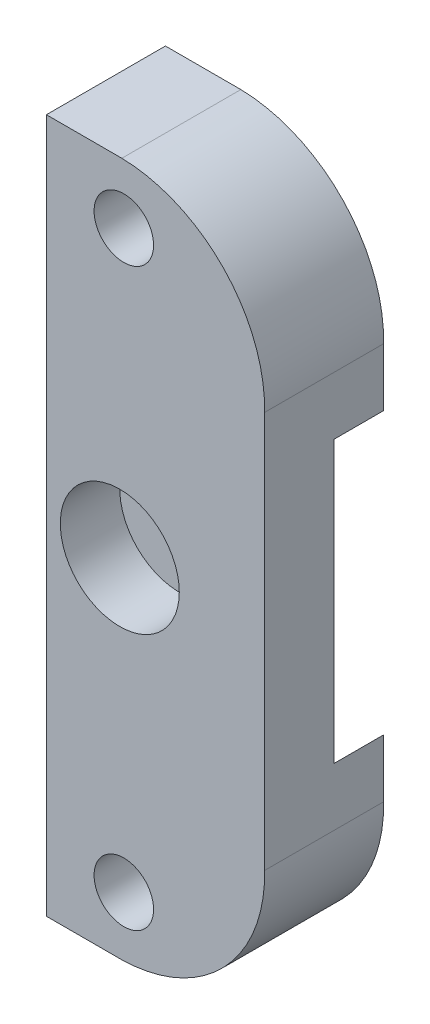
ISO-10303-21;
HEADER;
FILE_DESCRIPTION(('STEP AP214'),'2;1');
FILE_NAME('part.step','',(''),(''),'','','');
FILE_SCHEMA(('AUTOMOTIVE_DESIGN { 1 0 10303 214 1 1 1 1 }'));
ENDSEC;
DATA;
#1=APPLICATION_CONTEXT('core data for automotive mechanical design processes');
#2=APPLICATION_PROTOCOL_DEFINITION('international standard','automotive_design',2000,#1);
#3=PRODUCT_CONTEXT('',#1,'mechanical');
#4=PRODUCT('Part','Part','',(#3));
#5=PRODUCT_RELATED_PRODUCT_CATEGORY('part','',(#4));
#6=PRODUCT_DEFINITION_FORMATION('','',#4);
#7=PRODUCT_DEFINITION_CONTEXT('part definition',#1,'design');
#8=PRODUCT_DEFINITION('design','',#6,#7);
#9=PRODUCT_DEFINITION_SHAPE('','',#8);
#10=(LENGTH_UNIT() NAMED_UNIT(*) SI_UNIT(.MILLI.,.METRE.));
#11=(NAMED_UNIT(*) PLANE_ANGLE_UNIT() SI_UNIT($,.RADIAN.));
#12=(NAMED_UNIT(*) SI_UNIT($,.STERADIAN.) SOLID_ANGLE_UNIT());
#13=UNCERTAINTY_MEASURE_WITH_UNIT(LENGTH_MEASURE(1.E-05),#10,'distance_accuracy_value','');
#14=(GEOMETRIC_REPRESENTATION_CONTEXT(3) GLOBAL_UNCERTAINTY_ASSIGNED_CONTEXT((#13)) GLOBAL_UNIT_ASSIGNED_CONTEXT((#10,
#11,#12)) REPRESENTATION_CONTEXT('',''));
#15=CARTESIAN_POINT('',(0.,0.,0.));
#16=DIRECTION('',(0.,0.,1.));
#17=DIRECTION('',(1.,0.,0.));
#18=AXIS2_PLACEMENT_3D('',#15,#16,#17);
#19=CARTESIAN_POINT('',(0.,0.,-6.));
#20=DIRECTION('',(0.,0.,1.));
#21=DIRECTION('',(1.,0.,0.));
#22=AXIS2_PLACEMENT_3D('',#19,#20,#21);
#23=PLANE('',#22);
#24=CARTESIAN_POINT('',(-4.09693643450737,14.5,-6.));
#25=DIRECTION('',(0.,0.,1.));
#26=DIRECTION('',(1.,0.,0.));
#27=AXIS2_PLACEMENT_3D('',#24,#25,#26);
#28=CIRCLE('',#27,1.5);
#29=CARTESIAN_POINT('',(-2.59693643450737,14.5,-6.));
#30=VERTEX_POINT('',#29);
#31=EDGE_CURVE('E10',#30,#30,#28,.T.);
#32=ORIENTED_EDGE('',*,*,#31,.T.);
#33=EDGE_LOOP('',(#32));
#34=FACE_BOUND('',#33,.T.);
#35=CARTESIAN_POINT('',(-4.34843716076855,10.1515628392315,-6.));
#36=DIRECTION('',(0.,0.,1.));
#37=DIRECTION('',(1.,0.,0.));
#38=AXIS2_PLACEMENT_3D('',#35,#36,#37);
#39=CIRCLE('',#38,7.35);
#40=CARTESIAN_POINT('',(3.,10.,-6.));
#41=VERTEX_POINT('',#40);
#42=CARTESIAN_POINT('',(-4.19687432153708,17.5,-6.));
#43=VERTEX_POINT('',#42);
#44=EDGE_CURVE('E24',#41,#43,#39,.T.);
#45=ORIENTED_EDGE('',*,*,#44,.F.);
#46=DIRECTION('',(0.,-1.,0.));
#47=VECTOR('',#46,1.);
#48=CARTESIAN_POINT('',(3.,0.,-6.));
#49=LINE('',#48,#47);
#50=CARTESIAN_POINT('',(3.,7.07738194053648,-6.));
#51=VERTEX_POINT('',#50);
#52=EDGE_CURVE('E35',#41,#51,#49,.T.);
#53=ORIENTED_EDGE('',*,*,#52,.T.);
#54=CARTESIAN_POINT('',(-7.32548476671673,0.,-6.));
#55=DIRECTION('',(0.,0.,-1.));
#56=DIRECTION('',(-1.,0.,0.));
#57=AXIS2_PLACEMENT_3D('',#54,#55,#56);
#58=CIRCLE('',#57,12.5181856033505);
#59=CARTESIAN_POINT('',(-8.,12.5,-6.));
#60=VERTEX_POINT('',#59);
#61=EDGE_CURVE('E185',#60,#51,#58,.T.);
#62=ORIENTED_EDGE('',*,*,#61,.F.);
#63=DIRECTION('',(0.,1.,0.));
#64=VECTOR('',#63,1.);
#65=CARTESIAN_POINT('',(-8.,0.,-6.));
#66=LINE('',#65,#64);
#67=CARTESIAN_POINT('',(-8.,17.5,-6.));
#68=VERTEX_POINT('',#67);
#69=EDGE_CURVE('E182',#60,#68,#66,.T.);
#70=ORIENTED_EDGE('',*,*,#69,.T.);
#71=DIRECTION('',(-1.,0.,0.));
#72=VECTOR('',#71,1.);
#73=CARTESIAN_POINT('',(-4.34843716076855,17.5,-6.));
#74=LINE('',#73,#72);
#75=EDGE_CURVE('E179',#43,#68,#74,.T.);
#76=ORIENTED_EDGE('',*,*,#75,.F.);
#77=EDGE_LOOP('',(#45,#53,#62,#70,#76));
#78=FACE_BOUND('',#77,.T.);
#79=ADVANCED_FACE('F16',(#34,#78),#23,.F.);
#80=CARTESIAN_POINT('',(-7.32548476671673,0.,-3.5));
#81=DIRECTION('',(0.,0.,-1.));
#82=DIRECTION('',(-1.,0.,0.));
#83=AXIS2_PLACEMENT_3D('',#80,#81,#82);
#84=CYLINDRICAL_SURFACE('',#83,12.5181856033505);
#85=ORIENTED_EDGE('',*,*,#61,.T.);
#86=DIRECTION('',(0.,0.,-1.));
#87=VECTOR('',#86,1.);
#88=CARTESIAN_POINT('',(3.,7.07738194053648,-3.5));
#89=LINE('',#88,#87);
#90=CARTESIAN_POINT('',(3.,7.07738194053648,-3.5));
#91=VERTEX_POINT('',#90);
#92=EDGE_CURVE('E177',#51,#91,#89,.F.);
#93=ORIENTED_EDGE('',*,*,#92,.T.);
#94=CARTESIAN_POINT('',(-7.32548476671673,0.,-3.5));
#95=DIRECTION('',(0.,0.,-1.));
#96=DIRECTION('',(-1.,0.,0.));
#97=AXIS2_PLACEMENT_3D('',#94,#95,#96);
#98=CIRCLE('',#97,12.5181856033505);
#99=CARTESIAN_POINT('',(-8.,12.5,-3.5));
#100=VERTEX_POINT('',#99);
#101=EDGE_CURVE('E105',#100,#91,#98,.T.);
#102=ORIENTED_EDGE('',*,*,#101,.F.);
#103=DIRECTION('',(0.,0.,-1.));
#104=VECTOR('',#103,1.);
#105=CARTESIAN_POINT('',(-8.,12.5,-3.5));
#106=LINE('',#105,#104);
#107=EDGE_CURVE('E173',#100,#60,#106,.T.);
#108=ORIENTED_EDGE('',*,*,#107,.T.);
#109=EDGE_LOOP('',(#85,#93,#102,#108));
#110=FACE_BOUND('',#109,.T.);
#111=ADVANCED_FACE('F204',(#110),#84,.F.);
#112=CARTESIAN_POINT('',(3.,-7.07738194053649,-6.));
#113=VERTEX_POINT('',#112);
#114=CARTESIAN_POINT('',(-8.,-12.5,-6.));
#115=VERTEX_POINT('',#114);
#116=EDGE_CURVE('E175',#113,#115,#58,.T.);
#117=ORIENTED_EDGE('',*,*,#116,.F.);
#118=CARTESIAN_POINT('',(3.,-10.,-6.));
#119=VERTEX_POINT('',#118);
#120=EDGE_CURVE('E117',#113,#119,#49,.T.);
#121=ORIENTED_EDGE('',*,*,#120,.T.);
#122=CARTESIAN_POINT('',(-4.34843716076855,-10.1515628392315,-6.));
#123=DIRECTION('',(0.,0.,1.));
#124=DIRECTION('',(1.,0.,0.));
#125=AXIS2_PLACEMENT_3D('',#122,#123,#124);
#126=CIRCLE('',#125,7.35);
#127=CARTESIAN_POINT('',(-4.19687432153717,-17.5,-6.));
#128=VERTEX_POINT('',#127);
#129=EDGE_CURVE('E170',#128,#119,#126,.T.);
#130=ORIENTED_EDGE('',*,*,#129,.F.);
#131=DIRECTION('',(-1.,0.,0.));
#132=VECTOR('',#131,1.);
#133=CARTESIAN_POINT('',(-6.25,-17.5,-6.));
#134=LINE('',#133,#132);
#135=CARTESIAN_POINT('',(-8.,-17.5,-6.));
#136=VERTEX_POINT('',#135);
#137=EDGE_CURVE('E168',#128,#136,#134,.T.);
#138=ORIENTED_EDGE('',*,*,#137,.T.);
#139=EDGE_CURVE('E167',#136,#115,#66,.T.);
#140=ORIENTED_EDGE('',*,*,#139,.T.);
#141=EDGE_LOOP('',(#117,#121,#130,#138,#140));
#142=FACE_BOUND('',#141,.T.);
#143=CARTESIAN_POINT('',(-4.09693643450737,-14.5,-6.));
#144=DIRECTION('',(0.,0.,1.));
#145=DIRECTION('',(1.,0.,0.));
#146=AXIS2_PLACEMENT_3D('',#143,#144,#145);
#147=CIRCLE('',#146,1.5);
#148=CARTESIAN_POINT('',(-2.59693643450737,-14.5,-6.));
#149=VERTEX_POINT('',#148);
#150=EDGE_CURVE('E164',#149,#149,#147,.F.);
#151=ORIENTED_EDGE('',*,*,#150,.F.);
#152=EDGE_LOOP('',(#151));
#153=FACE_BOUND('',#152,.T.);
#154=ADVANCED_FACE('F18',(#142,#153),#23,.F.);
#155=CARTESIAN_POINT('',(0.,0.,0.));
#156=DIRECTION('',(0.,0.,1.));
#157=DIRECTION('',(1.,0.,0.));
#158=AXIS2_PLACEMENT_3D('',#155,#156,#157);
#159=PLANE('',#158);
#160=DIRECTION('',(0.,-1.,0.));
#161=VECTOR('',#160,1.);
#162=CARTESIAN_POINT('',(3.,0.,0.));
#163=LINE('',#162,#161);
#164=CARTESIAN_POINT('',(3.,10.,0.));
#165=VERTEX_POINT('',#164);
#166=CARTESIAN_POINT('',(3.,-10.,0.));
#167=VERTEX_POINT('',#166);
#168=EDGE_CURVE('E161',#165,#167,#163,.T.);
#169=ORIENTED_EDGE('',*,*,#168,.F.);
#170=CARTESIAN_POINT('',(-4.34843716076855,10.1515628392315,0.));
#171=DIRECTION('',(0.,0.,1.));
#172=DIRECTION('',(1.,0.,0.));
#173=AXIS2_PLACEMENT_3D('',#170,#171,#172);
#174=CIRCLE('',#173,7.35);
#175=CARTESIAN_POINT('',(-4.19687432153708,17.5,0.));
#176=VERTEX_POINT('',#175);
#177=EDGE_CURVE('E159',#165,#176,#174,.T.);
#178=ORIENTED_EDGE('',*,*,#177,.T.);
#179=DIRECTION('',(-1.,0.,0.));
#180=VECTOR('',#179,1.);
#181=CARTESIAN_POINT('',(-4.34843716076855,17.5,0.));
#182=LINE('',#181,#180);
#183=CARTESIAN_POINT('',(-8.,17.5,0.));
#184=VERTEX_POINT('',#183);
#185=EDGE_CURVE('E157',#176,#184,#182,.T.);
#186=ORIENTED_EDGE('',*,*,#185,.T.);
#187=DIRECTION('',(0.,1.,0.));
#188=VECTOR('',#187,1.);
#189=CARTESIAN_POINT('',(-8.,0.,0.));
#190=LINE('',#189,#188);
#191=CARTESIAN_POINT('',(-8.,-17.5,0.));
#192=VERTEX_POINT('',#191);
#193=EDGE_CURVE('E154',#192,#184,#190,.T.);
#194=ORIENTED_EDGE('',*,*,#193,.F.);
#195=DIRECTION('',(-1.,0.,0.));
#196=VECTOR('',#195,1.);
#197=CARTESIAN_POINT('',(-6.25,-17.5,0.));
#198=LINE('',#197,#196);
#199=CARTESIAN_POINT('',(-4.19687432153717,-17.5,0.));
#200=VERTEX_POINT('',#199);
#201=EDGE_CURVE('E151',#200,#192,#198,.T.);
#202=ORIENTED_EDGE('',*,*,#201,.F.);
#203=CARTESIAN_POINT('',(-4.34843716076855,-10.1515628392315,0.));
#204=DIRECTION('',(0.,0.,1.));
#205=DIRECTION('',(1.,0.,0.));
#206=AXIS2_PLACEMENT_3D('',#203,#204,#205);
#207=CIRCLE('',#206,7.35);
#208=EDGE_CURVE('E149',#200,#167,#207,.T.);
#209=ORIENTED_EDGE('',*,*,#208,.T.);
#210=EDGE_LOOP('',(#169,#178,#186,#194,#202,#209));
#211=FACE_BOUND('',#210,.T.);
#212=CARTESIAN_POINT('',(-4.3,0.,0.));
#213=DIRECTION('',(0.,0.,1.));
#214=DIRECTION('',(1.,0.,0.));
#215=AXIS2_PLACEMENT_3D('',#212,#213,#214);
#216=CIRCLE('',#215,3.);
#217=CARTESIAN_POINT('',(-1.3,0.,0.));
#218=VERTEX_POINT('',#217);
#219=EDGE_CURVE('E146',#218,#218,#216,.T.);
#220=ORIENTED_EDGE('',*,*,#219,.F.);
#221=EDGE_LOOP('',(#220));
#222=FACE_BOUND('',#221,.T.);
#223=CARTESIAN_POINT('',(-4.09693643450737,-14.5,0.));
#224=DIRECTION('',(0.,0.,-1.));
#225=DIRECTION('',(1.,0.,0.));
#226=AXIS2_PLACEMENT_3D('',#223,#224,#225);
#227=CIRCLE('',#226,1.5);
#228=CARTESIAN_POINT('',(-2.59693643450737,-14.5,0.));
#229=VERTEX_POINT('',#228);
#230=EDGE_CURVE('E143',#229,#229,#227,.T.);
#231=ORIENTED_EDGE('',*,*,#230,.T.);
#232=EDGE_LOOP('',(#231));
#233=FACE_BOUND('',#232,.T.);
#234=CARTESIAN_POINT('',(-4.09693643450737,14.5,0.));
#235=DIRECTION('',(0.,0.,1.));
#236=DIRECTION('',(1.,0.,0.));
#237=AXIS2_PLACEMENT_3D('',#234,#235,#236);
#238=CIRCLE('',#237,1.5);
#239=CARTESIAN_POINT('',(-2.59693643450737,14.5,0.));
#240=VERTEX_POINT('',#239);
#241=EDGE_CURVE('E140',#240,#240,#238,.T.);
#242=ORIENTED_EDGE('',*,*,#241,.F.);
#243=EDGE_LOOP('',(#242));
#244=FACE_BOUND('',#243,.T.);
#245=ADVANCED_FACE('F200',(#211,#222,#233,#244),#159,.T.);
#246=CARTESIAN_POINT('',(-4.34843716076855,17.5,-6.));
#247=DIRECTION('',(0.,1.,0.));
#248=DIRECTION('',(0.,0.,1.));
#249=AXIS2_PLACEMENT_3D('',#246,#247,#248);
#250=PLANE('',#249);
#251=ORIENTED_EDGE('',*,*,#185,.F.);
#252=DIRECTION('',(0.,0.,1.));
#253=VECTOR('',#252,1.);
#254=CARTESIAN_POINT('',(-4.19687432153708,17.5,-6.));
#255=LINE('',#254,#253);
#256=EDGE_CURVE('E137',#43,#176,#255,.T.);
#257=ORIENTED_EDGE('',*,*,#256,.F.);
#258=ORIENTED_EDGE('',*,*,#75,.T.);
#259=DIRECTION('',(0.,0.,1.));
#260=VECTOR('',#259,1.);
#261=CARTESIAN_POINT('',(-8.,17.5,-6.));
#262=LINE('',#261,#260);
#263=EDGE_CURVE('E134',#68,#184,#262,.T.);
#264=ORIENTED_EDGE('',*,*,#263,.T.);
#265=EDGE_LOOP('',(#251,#257,#258,#264));
#266=FACE_BOUND('',#265,.T.);
#267=ADVANCED_FACE('F195',(#266),#250,.T.);
#268=CARTESIAN_POINT('',(-8.,0.,-6.));
#269=DIRECTION('',(1.,0.,0.));
#270=DIRECTION('',(0.,1.,0.));
#271=AXIS2_PLACEMENT_3D('',#268,#269,#270);
#272=PLANE('',#271);
#273=DIRECTION('',(0.,1.,0.));
#274=VECTOR('',#273,1.);
#275=CARTESIAN_POINT('',(-8.,0.,-3.5));
#276=LINE('',#275,#274);
#277=CARTESIAN_POINT('',(-8.,-12.5,-3.5));
#278=VERTEX_POINT('',#277);
#279=EDGE_CURVE('E132',#278,#100,#276,.T.);
#280=ORIENTED_EDGE('',*,*,#279,.F.);
#281=DIRECTION('',(0.,0.,-1.));
#282=VECTOR('',#281,1.);
#283=CARTESIAN_POINT('',(-8.,-12.5,-3.5));
#284=LINE('',#283,#282);
#285=EDGE_CURVE('E100',#278,#115,#284,.T.);
#286=ORIENTED_EDGE('',*,*,#285,.T.);
#287=ORIENTED_EDGE('',*,*,#139,.F.);
#288=DIRECTION('',(0.,0.,1.));
#289=VECTOR('',#288,1.);
#290=CARTESIAN_POINT('',(-8.,-17.5,-6.));
#291=LINE('',#290,#289);
#292=EDGE_CURVE('E128',#136,#192,#291,.T.);
#293=ORIENTED_EDGE('',*,*,#292,.T.);
#294=ORIENTED_EDGE('',*,*,#193,.T.);
#295=ORIENTED_EDGE('',*,*,#263,.F.);
#296=ORIENTED_EDGE('',*,*,#69,.F.);
#297=ORIENTED_EDGE('',*,*,#107,.F.);
#298=EDGE_LOOP('',(#280,#286,#287,#293,#294,#295,#296,#297));
#299=FACE_BOUND('',#298,.T.);
#300=ADVANCED_FACE('F196',(#299),#272,.F.);
#301=CARTESIAN_POINT('',(-6.25,-17.5,-6.));
#302=DIRECTION('',(0.,1.,0.));
#303=DIRECTION('',(0.,0.,1.));
#304=AXIS2_PLACEMENT_3D('',#301,#302,#303);
#305=PLANE('',#304);
#306=ORIENTED_EDGE('',*,*,#201,.T.);
#307=ORIENTED_EDGE('',*,*,#292,.F.);
#308=ORIENTED_EDGE('',*,*,#137,.F.);
#309=DIRECTION('',(0.,0.,1.));
#310=VECTOR('',#309,1.);
#311=CARTESIAN_POINT('',(-4.19687432153717,-17.5,-6.));
#312=LINE('',#311,#310);
#313=EDGE_CURVE('E125',#128,#200,#312,.T.);
#314=ORIENTED_EDGE('',*,*,#313,.T.);
#315=EDGE_LOOP('',(#306,#307,#308,#314));
#316=FACE_BOUND('',#315,.T.);
#317=ADVANCED_FACE('F210',(#316),#305,.F.);
#318=CARTESIAN_POINT('',(-4.34843716076855,-10.1515628392315,-6.));
#319=DIRECTION('',(0.,0.,1.));
#320=DIRECTION('',(1.,0.,0.));
#321=AXIS2_PLACEMENT_3D('',#318,#319,#320);
#322=CYLINDRICAL_SURFACE('',#321,7.35);
#323=ORIENTED_EDGE('',*,*,#208,.F.);
#324=ORIENTED_EDGE('',*,*,#313,.F.);
#325=ORIENTED_EDGE('',*,*,#129,.T.);
#326=DIRECTION('',(0.,0.,1.));
#327=VECTOR('',#326,1.);
#328=CARTESIAN_POINT('',(3.,-10.,-6.));
#329=LINE('',#328,#327);
#330=EDGE_CURVE('E122',#119,#167,#329,.T.);
#331=ORIENTED_EDGE('',*,*,#330,.T.);
#332=EDGE_LOOP('',(#323,#324,#325,#331));
#333=FACE_BOUND('',#332,.T.);
#334=ADVANCED_FACE('F213',(#333),#322,.T.);
#335=CARTESIAN_POINT('',(-4.34843716076855,10.1515628392315,-6.));
#336=DIRECTION('',(0.,0.,1.));
#337=DIRECTION('',(1.,0.,0.));
#338=AXIS2_PLACEMENT_3D('',#335,#336,#337);
#339=CYLINDRICAL_SURFACE('',#338,7.35);
#340=ORIENTED_EDGE('',*,*,#177,.F.);
#341=DIRECTION('',(0.,0.,1.));
#342=VECTOR('',#341,1.);
#343=CARTESIAN_POINT('',(3.,10.,-6.));
#344=LINE('',#343,#342);
#345=EDGE_CURVE('E103',#41,#165,#344,.T.);
#346=ORIENTED_EDGE('',*,*,#345,.F.);
#347=ORIENTED_EDGE('',*,*,#44,.T.);
#348=ORIENTED_EDGE('',*,*,#256,.T.);
#349=EDGE_LOOP('',(#340,#346,#347,#348));
#350=FACE_BOUND('',#349,.T.);
#351=ADVANCED_FACE('F203',(#350),#339,.T.);
#352=CARTESIAN_POINT('',(3.,-7.07738194053649,-3.5));
#353=VERTEX_POINT('',#352);
#354=EDGE_CURVE('E92',#353,#278,#98,.T.);
#355=ORIENTED_EDGE('',*,*,#354,.F.);
#356=DIRECTION('',(0.,0.,-1.));
#357=VECTOR('',#356,1.);
#358=CARTESIAN_POINT('',(3.,-7.07738194053649,-3.5));
#359=LINE('',#358,#357);
#360=EDGE_CURVE('E97',#353,#113,#359,.T.);
#361=ORIENTED_EDGE('',*,*,#360,.T.);
#362=ORIENTED_EDGE('',*,*,#116,.T.);
#363=ORIENTED_EDGE('',*,*,#285,.F.);
#364=EDGE_LOOP('',(#355,#361,#362,#363));
#365=FACE_BOUND('',#364,.T.);
#366=ADVANCED_FACE('F94',(#365),#84,.F.);
#367=CARTESIAN_POINT('',(0.,0.,-3.5));
#368=DIRECTION('',(0.,0.,-1.));
#369=DIRECTION('',(1.,0.,0.));
#370=AXIS2_PLACEMENT_3D('',#367,#368,#369);
#371=PLANE('',#370);
#372=DIRECTION('',(0.,1.,0.));
#373=VECTOR('',#372,1.);
#374=CARTESIAN_POINT('',(3.,0.,-3.5));
#375=LINE('',#374,#373);
#376=EDGE_CURVE('E108',#353,#91,#375,.T.);
#377=ORIENTED_EDGE('',*,*,#376,.F.);
#378=ORIENTED_EDGE('',*,*,#354,.T.);
#379=ORIENTED_EDGE('',*,*,#279,.T.);
#380=ORIENTED_EDGE('',*,*,#101,.T.);
#381=EDGE_LOOP('',(#377,#378,#379,#380));
#382=FACE_BOUND('',#381,.T.);
#383=ADVANCED_FACE('F109',(#382),#371,.T.);
#384=CARTESIAN_POINT('',(-4.09693643450737,-14.5,-25.));
#385=DIRECTION('',(0.,0.,1.));
#386=DIRECTION('',(1.,0.,0.));
#387=AXIS2_PLACEMENT_3D('',#384,#385,#386);
#388=CYLINDRICAL_SURFACE('',#387,1.5);
#389=ORIENTED_EDGE('',*,*,#230,.F.);
#390=EDGE_LOOP('',(#389));
#391=FACE_BOUND('',#390,.T.);
#392=ORIENTED_EDGE('',*,*,#150,.T.);
#393=EDGE_LOOP('',(#392));
#394=FACE_BOUND('',#393,.T.);
#395=ADVANCED_FACE('F243',(#391,#394),#388,.F.);
#396=CARTESIAN_POINT('',(-4.09693643450737,14.5,-25.));
#397=DIRECTION('',(0.,0.,1.));
#398=DIRECTION('',(1.,0.,0.));
#399=AXIS2_PLACEMENT_3D('',#396,#397,#398);
#400=CYLINDRICAL_SURFACE('',#399,1.5);
#401=ORIENTED_EDGE('',*,*,#241,.T.);
#402=EDGE_LOOP('',(#401));
#403=FACE_BOUND('',#402,.T.);
#404=ORIENTED_EDGE('',*,*,#31,.F.);
#405=EDGE_LOOP('',(#404));
#406=FACE_BOUND('',#405,.T.);
#407=ADVANCED_FACE('F248',(#403,#406),#400,.F.);
#408=CARTESIAN_POINT('',(-4.3,0.,-3.));
#409=DIRECTION('',(0.,0.,1.));
#410=DIRECTION('',(1.,0.,0.));
#411=AXIS2_PLACEMENT_3D('',#408,#409,#410);
#412=CYLINDRICAL_SURFACE('',#411,3.);
#413=CARTESIAN_POINT('',(-4.3,0.,-3.));
#414=DIRECTION('',(0.,0.,1.));
#415=DIRECTION('',(1.,0.,0.));
#416=AXIS2_PLACEMENT_3D('',#413,#414,#415);
#417=CIRCLE('',#416,3.);
#418=CARTESIAN_POINT('',(-1.3,0.,-3.));
#419=VERTEX_POINT('',#418);
#420=EDGE_CURVE('E112',#419,#419,#417,.T.);
#421=ORIENTED_EDGE('',*,*,#420,.F.);
#422=EDGE_LOOP('',(#421));
#423=FACE_BOUND('',#422,.T.);
#424=ORIENTED_EDGE('',*,*,#219,.T.);
#425=EDGE_LOOP('',(#424));
#426=FACE_BOUND('',#425,.T.);
#427=ADVANCED_FACE('F254',(#423,#426),#412,.F.);
#428=CARTESIAN_POINT('',(0.,0.,-3.));
#429=DIRECTION('',(0.,0.,1.));
#430=DIRECTION('',(1.,0.,0.));
#431=AXIS2_PLACEMENT_3D('',#428,#429,#430);
#432=PLANE('',#431);
#433=ORIENTED_EDGE('',*,*,#420,.T.);
#434=EDGE_LOOP('',(#433));
#435=FACE_BOUND('',#434,.T.);
#436=ADVANCED_FACE('F258',(#435),#432,.T.);
#437=CARTESIAN_POINT('',(3.,0.,-25.));
#438=DIRECTION('',(-1.,0.,0.));
#439=DIRECTION('',(0.,-1.,0.));
#440=AXIS2_PLACEMENT_3D('',#437,#438,#439);
#441=PLANE('',#440);
#442=ORIENTED_EDGE('',*,*,#345,.T.);
#443=ORIENTED_EDGE('',*,*,#168,.T.);
#444=ORIENTED_EDGE('',*,*,#330,.F.);
#445=ORIENTED_EDGE('',*,*,#120,.F.);
#446=ORIENTED_EDGE('',*,*,#360,.F.);
#447=ORIENTED_EDGE('',*,*,#376,.T.);
#448=ORIENTED_EDGE('',*,*,#92,.F.);
#449=ORIENTED_EDGE('',*,*,#52,.F.);
#450=EDGE_LOOP('',(#442,#443,#444,#445,#446,#447,#448,#449));
#451=FACE_BOUND('',#450,.T.);
#452=ADVANCED_FACE('F115',(#451),#441,.F.);
#453=CLOSED_SHELL('',(#79,#111,#154,#245,#267,#300,#317,#334,#351,#366,#383,#395,#407,#427,#436,#452));
#454=MANIFOLD_SOLID_BREP('B1',#453);
#455=ADVANCED_BREP_SHAPE_REPRESENTATION('',(#18,#454),#14);
#456=SHAPE_DEFINITION_REPRESENTATION(#9,#455);
ENDSEC;
END-ISO-10303-21;
